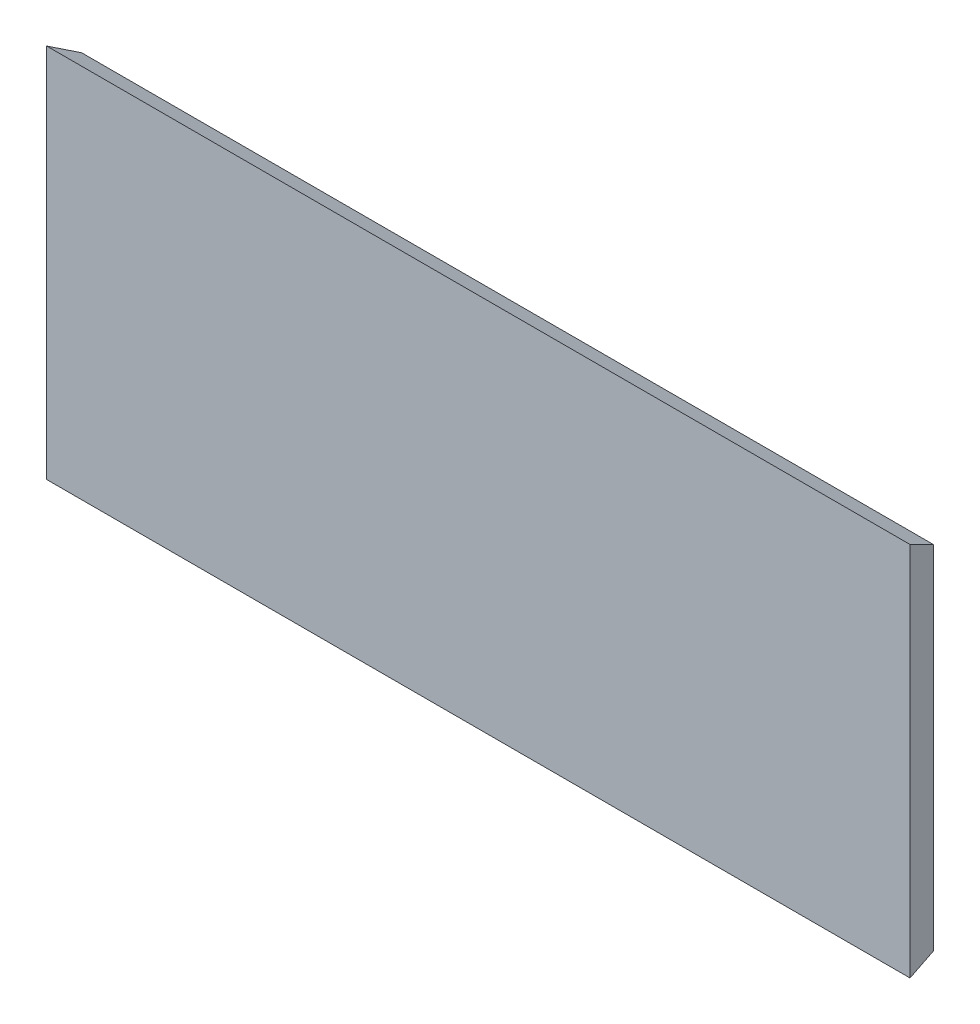
ISO-10303-21;
HEADER;
FILE_DESCRIPTION(('STEP AP214'),'2;1');
FILE_NAME('part.step','',(''),(''),'','','');
FILE_SCHEMA(('AUTOMOTIVE_DESIGN { 1 0 10303 214 1 1 1 1 }'));
ENDSEC;
DATA;
#1=APPLICATION_CONTEXT('core data for automotive mechanical design processes');
#2=APPLICATION_PROTOCOL_DEFINITION('international standard','automotive_design',2000,#1);
#3=PRODUCT_CONTEXT('',#1,'mechanical');
#4=PRODUCT('Part','Part','',(#3));
#5=PRODUCT_RELATED_PRODUCT_CATEGORY('part','',(#4));
#6=PRODUCT_DEFINITION_FORMATION('','',#4);
#7=PRODUCT_DEFINITION_CONTEXT('part definition',#1,'design');
#8=PRODUCT_DEFINITION('design','',#6,#7);
#9=PRODUCT_DEFINITION_SHAPE('','',#8);
#10=(LENGTH_UNIT() NAMED_UNIT(*) SI_UNIT(.MILLI.,.METRE.));
#11=(NAMED_UNIT(*) PLANE_ANGLE_UNIT() SI_UNIT($,.RADIAN.));
#12=(NAMED_UNIT(*) SI_UNIT($,.STERADIAN.) SOLID_ANGLE_UNIT());
#13=UNCERTAINTY_MEASURE_WITH_UNIT(LENGTH_MEASURE(1.E-05),#10,'distance_accuracy_value','');
#14=(GEOMETRIC_REPRESENTATION_CONTEXT(3) GLOBAL_UNCERTAINTY_ASSIGNED_CONTEXT((#13)) GLOBAL_UNIT_ASSIGNED_CONTEXT((#10,
#11,#12)) REPRESENTATION_CONTEXT('',''));
#15=CARTESIAN_POINT('',(0.,0.,0.));
#16=DIRECTION('',(0.,0.,1.));
#17=DIRECTION('',(1.,0.,0.));
#18=AXIS2_PLACEMENT_3D('',#15,#16,#17);
#19=CARTESIAN_POINT('',(-1.5,-23.6,3.42360679774997));
#20=DIRECTION('',(0.,-0.894427190999916,-0.447213595499958));
#21=DIRECTION('',(0.,0.447213595499958,-0.894427190999916));
#22=AXIS2_PLACEMENT_3D('',#19,#20,#21);
#23=PLANE('',#22);
#24=DIRECTION('',(0.,0.447213595499958,-0.894427190999916));
#25=VECTOR('',#24,1.);
#26=CARTESIAN_POINT('',(107.5,-23.6,3.42360679774997));
#27=LINE('',#26,#25);
#28=CARTESIAN_POINT('',(107.5,-23.338196601125,2.9));
#29=VERTEX_POINT('',#28);
#30=CARTESIAN_POINT('',(107.5,-21.888196601125,0.));
#31=VERTEX_POINT('',#30);
#32=EDGE_CURVE('E89',#29,#31,#27,.T.);
#33=ORIENTED_EDGE('',*,*,#32,.F.);
#34=DIRECTION('',(-1.,0.,0.));
#35=VECTOR('',#34,1.);
#36=CARTESIAN_POINT('',(-1.5,-23.338196601125,2.9));
#37=LINE('',#36,#35);
#38=CARTESIAN_POINT('',(0.162011557248755,-23.338196601125,2.9));
#39=VERTEX_POINT('',#38);
#40=EDGE_CURVE('E95',#29,#39,#37,.T.);
#41=ORIENTED_EDGE('',*,*,#40,.T.);
#42=DIRECTION('',(0.4081986844937,0.408258210934603,-0.816516421869205));
#43=VECTOR('',#42,1.);
#44=CARTESIAN_POINT('',(-0.33307134675115,-23.8333517016418,3.89031020103363));
#45=LINE('',#44,#43);
#46=CARTESIAN_POINT('',(1.61180013874694,-21.888196601125,0.));
#47=VERTEX_POINT('',#46);
#48=EDGE_CURVE('E11',#39,#47,#45,.T.);
#49=ORIENTED_EDGE('',*,*,#48,.T.);
#50=DIRECTION('',(-1.,0.,0.));
#51=VECTOR('',#50,1.);
#52=CARTESIAN_POINT('',(0.,-21.888196601125,0.));
#53=LINE('',#52,#51);
#54=EDGE_CURVE('E93',#31,#47,#53,.T.);
#55=ORIENTED_EDGE('',*,*,#54,.F.);
#56=EDGE_LOOP('',(#33,#41,#49,#55));
#57=FACE_BOUND('',#56,.T.);
#58=ADVANCED_FACE('F45',(#57),#23,.T.);
#59=CARTESIAN_POINT('',(107.5,0.,3.));
#60=DIRECTION('',(-1.,0.,0.));
#61=DIRECTION('',(0.,0.,1.));
#62=AXIS2_PLACEMENT_3D('',#59,#60,#61);
#63=PLANE('',#62);
#64=DIRECTION('',(0.,1.,0.));
#65=VECTOR('',#64,1.);
#66=CARTESIAN_POINT('',(107.5,23.388196601125,2.9));
#67=LINE('',#66,#65);
#68=CARTESIAN_POINT('',(107.5,23.338196601125,2.9));
#69=VERTEX_POINT('',#68);
#70=EDGE_CURVE('E86',#29,#69,#67,.T.);
#71=ORIENTED_EDGE('',*,*,#70,.F.);
#72=ORIENTED_EDGE('',*,*,#32,.T.);
#73=DIRECTION('',(0.,1.,0.));
#74=VECTOR('',#73,1.);
#75=CARTESIAN_POINT('',(107.5,0.,0.));
#76=LINE('',#75,#74);
#77=CARTESIAN_POINT('',(107.5,21.888196601125,0.));
#78=VERTEX_POINT('',#77);
#79=EDGE_CURVE('E113',#31,#78,#76,.T.);
#80=ORIENTED_EDGE('',*,*,#79,.T.);
#81=DIRECTION('',(0.,-0.447213595499958,-0.894427190999916));
#82=VECTOR('',#81,1.);
#83=CARTESIAN_POINT('',(107.5,23.6,3.42360679774997));
#84=LINE('',#83,#82);
#85=EDGE_CURVE('E91',#69,#78,#84,.T.);
#86=ORIENTED_EDGE('',*,*,#85,.F.);
#87=EDGE_LOOP('',(#71,#72,#80,#86));
#88=FACE_BOUND('',#87,.T.);
#89=ADVANCED_FACE('F47',(#88),#63,.F.);
#90=CARTESIAN_POINT('',(1.66179284845378,23.5,-0.1));
#91=DIRECTION('',(0.894453272784959,0.,0.447161428126661));
#92=DIRECTION('',(0.447161428126661,0.,-0.89445327278496));
#93=AXIS2_PLACEMENT_3D('',#90,#91,#92);
#94=PLANE('',#93);
#95=ORIENTED_EDGE('',*,*,#48,.F.);
#96=DIRECTION('',(0.,-1.,0.));
#97=VECTOR('',#96,1.);
#98=CARTESIAN_POINT('',(0.162011557248755,23.5,2.9));
#99=LINE('',#98,#97);
#100=CARTESIAN_POINT('',(0.162011557248755,23.338196601125,2.9));
#101=VERTEX_POINT('',#100);
#102=EDGE_CURVE('E54',#101,#39,#99,.T.);
#103=ORIENTED_EDGE('',*,*,#102,.F.);
#104=DIRECTION('',(-0.4081986844937,0.408258210934603,0.816516421869205));
#105=VECTOR('',#104,1.);
#106=CARTESIAN_POINT('',(-0.33307134675115,23.8333517016418,3.89031020103363));
#107=LINE('',#106,#105);
#108=CARTESIAN_POINT('',(1.61180013874694,21.888196601125,0.));
#109=VERTEX_POINT('',#108);
#110=EDGE_CURVE('E120',#109,#101,#107,.T.);
#111=ORIENTED_EDGE('',*,*,#110,.F.);
#112=DIRECTION('',(0.,-1.,0.));
#113=VECTOR('',#112,1.);
#114=CARTESIAN_POINT('',(1.61180013874694,0.,0.));
#115=LINE('',#114,#113);
#116=EDGE_CURVE('E108',#109,#47,#115,.T.);
#117=ORIENTED_EDGE('',*,*,#116,.T.);
#118=EDGE_LOOP('',(#95,#103,#111,#117));
#119=FACE_BOUND('',#118,.T.);
#120=ADVANCED_FACE('F129',(#119),#94,.F.);
#121=CARTESIAN_POINT('',(0.,0.,0.));
#122=DIRECTION('',(0.,0.,-1.));
#123=DIRECTION('',(-1.,0.,0.));
#124=AXIS2_PLACEMENT_3D('',#121,#122,#123);
#125=PLANE('',#124);
#126=ORIENTED_EDGE('',*,*,#54,.T.);
#127=ORIENTED_EDGE('',*,*,#116,.F.);
#128=DIRECTION('',(-1.,0.,0.));
#129=VECTOR('',#128,1.);
#130=CARTESIAN_POINT('',(0.,21.888196601125,0.));
#131=LINE('',#130,#129);
#132=EDGE_CURVE('E116',#78,#109,#131,.T.);
#133=ORIENTED_EDGE('',*,*,#132,.F.);
#134=ORIENTED_EDGE('',*,*,#79,.F.);
#135=EDGE_LOOP('',(#126,#127,#133,#134));
#136=FACE_BOUND('',#135,.T.);
#137=ADVANCED_FACE('F131',(#136),#125,.T.);
#138=CARTESIAN_POINT('',(-1.5,23.6,3.42360679774997));
#139=DIRECTION('',(0.,-0.894427190999916,0.447213595499958));
#140=DIRECTION('',(0.,-0.447213595499958,-0.894427190999916));
#141=AXIS2_PLACEMENT_3D('',#138,#139,#140);
#142=PLANE('',#141);
#143=DIRECTION('',(-1.,0.,0.));
#144=VECTOR('',#143,1.);
#145=CARTESIAN_POINT('',(-1.5,23.338196601125,2.9));
#146=LINE('',#145,#144);
#147=EDGE_CURVE('E67',#69,#101,#146,.T.);
#148=ORIENTED_EDGE('',*,*,#147,.F.);
#149=ORIENTED_EDGE('',*,*,#85,.T.);
#150=ORIENTED_EDGE('',*,*,#132,.T.);
#151=ORIENTED_EDGE('',*,*,#110,.T.);
#152=EDGE_LOOP('',(#148,#149,#150,#151));
#153=FACE_BOUND('',#152,.T.);
#154=ADVANCED_FACE('F125',(#153),#142,.F.);
#155=CARTESIAN_POINT('',(0.,0.,2.9));
#156=DIRECTION('',(0.,0.,1.));
#157=DIRECTION('',(1.,0.,0.));
#158=AXIS2_PLACEMENT_3D('',#155,#156,#157);
#159=PLANE('',#158);
#160=ORIENTED_EDGE('',*,*,#147,.T.);
#161=ORIENTED_EDGE('',*,*,#102,.T.);
#162=ORIENTED_EDGE('',*,*,#40,.F.);
#163=ORIENTED_EDGE('',*,*,#70,.T.);
#164=EDGE_LOOP('',(#160,#161,#162,#163));
#165=FACE_BOUND('',#164,.T.);
#166=ADVANCED_FACE('F96',(#165),#159,.T.);
#167=CLOSED_SHELL('',(#58,#89,#120,#137,#154,#166));
#168=MANIFOLD_SOLID_BREP('B2',#167);
#169=ADVANCED_BREP_SHAPE_REPRESENTATION('',(#18,#168),#14);
#170=SHAPE_DEFINITION_REPRESENTATION(#9,#169);
ENDSEC;
END-ISO-10303-21;
